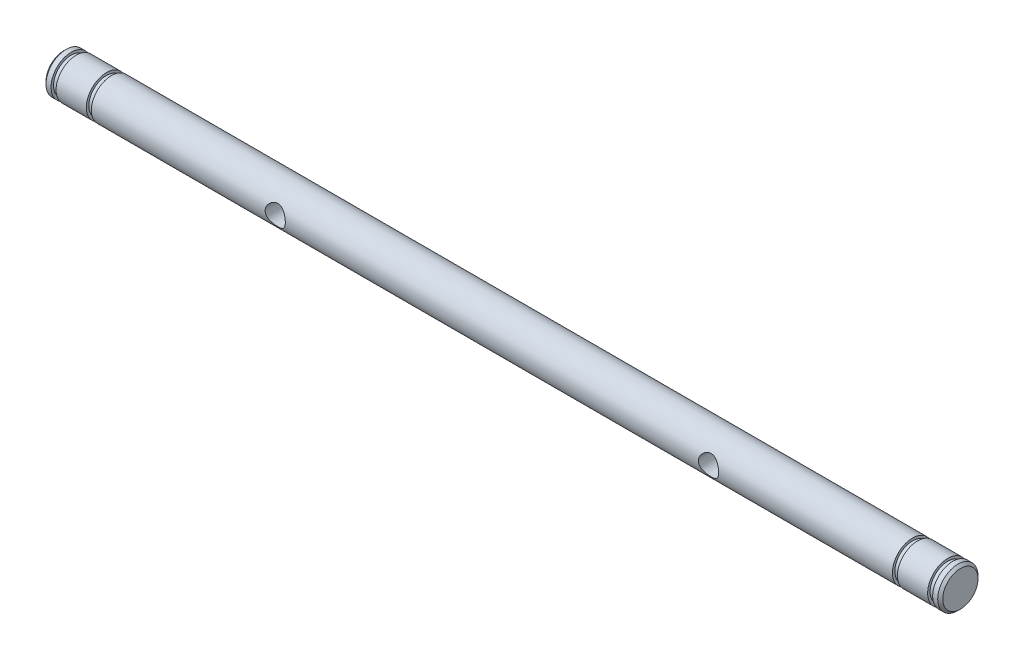
ISO-10303-21;
HEADER;
FILE_DESCRIPTION(('STEP AP214'),'2;1');
FILE_NAME('part.step','',(''),(''),'','','');
FILE_SCHEMA(('AUTOMOTIVE_DESIGN { 1 0 10303 214 1 1 1 1 }'));
ENDSEC;
DATA;
#1=APPLICATION_CONTEXT('core data for automotive mechanical design processes');
#2=APPLICATION_PROTOCOL_DEFINITION('international standard','automotive_design',2000,#1);
#3=PRODUCT_CONTEXT('',#1,'mechanical');
#4=PRODUCT('Part','Part','',(#3));
#5=PRODUCT_RELATED_PRODUCT_CATEGORY('part','',(#4));
#6=PRODUCT_DEFINITION_FORMATION('','',#4);
#7=PRODUCT_DEFINITION_CONTEXT('part definition',#1,'design');
#8=PRODUCT_DEFINITION('design','',#6,#7);
#9=PRODUCT_DEFINITION_SHAPE('','',#8);
#10=(LENGTH_UNIT() NAMED_UNIT(*) SI_UNIT(.MILLI.,.METRE.));
#11=(NAMED_UNIT(*) PLANE_ANGLE_UNIT() SI_UNIT($,.RADIAN.));
#12=(NAMED_UNIT(*) SI_UNIT($,.STERADIAN.) SOLID_ANGLE_UNIT());
#13=UNCERTAINTY_MEASURE_WITH_UNIT(LENGTH_MEASURE(1.E-05),#10,'distance_accuracy_value','');
#14=(GEOMETRIC_REPRESENTATION_CONTEXT(3) GLOBAL_UNCERTAINTY_ASSIGNED_CONTEXT((#13)) GLOBAL_UNIT_ASSIGNED_CONTEXT((#10,
#11,#12)) REPRESENTATION_CONTEXT('',''));
#15=CARTESIAN_POINT('',(0.,0.,0.));
#16=DIRECTION('',(0.,0.,1.));
#17=DIRECTION('',(1.,0.,0.));
#18=AXIS2_PLACEMENT_3D('',#15,#16,#17);
#19=CARTESIAN_POINT('',(79.5,3.5,0.));
#20=DIRECTION('',(-1.,0.,0.));
#21=DIRECTION('',(0.,0.,1.));
#22=AXIS2_PLACEMENT_3D('',#19,#20,#21);
#23=PLANE('',#22);
#24=CARTESIAN_POINT('',(79.5,0.,0.));
#25=DIRECTION('',(-1.,0.,0.));
#26=DIRECTION('',(0.,0.,1.));
#27=AXIS2_PLACEMENT_3D('',#24,#25,#26);
#28=CIRCLE('',#27,4.);
#29=CARTESIAN_POINT('',(79.5,0.,4.));
#30=VERTEX_POINT('',#29);
#31=EDGE_CURVE('E100',#30,#30,#28,.T.);
#32=ORIENTED_EDGE('',*,*,#31,.F.);
#33=EDGE_LOOP('',(#32));
#34=FACE_BOUND('',#33,.T.);
#35=CARTESIAN_POINT('',(79.5,0.,0.));
#36=DIRECTION('',(-1.,0.,0.));
#37=DIRECTION('',(0.,0.,1.));
#38=AXIS2_PLACEMENT_3D('',#35,#36,#37);
#39=CIRCLE('',#38,3.5);
#40=CARTESIAN_POINT('',(79.5,0.,3.5));
#41=VERTEX_POINT('',#40);
#42=EDGE_CURVE('E145',#41,#41,#39,.T.);
#43=ORIENTED_EDGE('',*,*,#42,.T.);
#44=EDGE_LOOP('',(#43));
#45=FACE_BOUND('',#44,.T.);
#46=ADVANCED_FACE('F44',(#34,#45),#23,.F.);
#47=CARTESIAN_POINT('',(25.5103340616513,0.,0.));
#48=DIRECTION('',(-1.,0.,0.));
#49=DIRECTION('',(0.,0.,1.));
#50=AXIS2_PLACEMENT_3D('',#47,#48,#49);
#51=CYLINDRICAL_SURFACE('',#50,3.99999999999999);
#52=CARTESIAN_POINT('',(-41.,0.,3.99999999999999));
#53=CARTESIAN_POINT('',(-41.0000066046344,-0.105143925902467,3.99999426810081));
#54=CARTESIAN_POINT('',(-41.0083401462421,-0.210413199395126,3.99580982039512));
#55=CARTESIAN_POINT('',(-41.0413057606831,-0.417840470537793,3.97948312074313));
#56=CARTESIAN_POINT('',(-41.0659687859956,-0.519992173427259,3.96732575657838));
#57=CARTESIAN_POINT('',(-41.1303876172333,-0.717867089760898,3.9363255880675));
#58=CARTESIAN_POINT('',(-41.1700847684959,-0.813613605878294,3.91750878355074));
#59=CARTESIAN_POINT('',(-41.26314124273,-0.9969452336132,3.87491553031522));
#60=CARTESIAN_POINT('',(-41.3164994884977,-1.08453098798012,3.85113947267049));
#61=CARTESIAN_POINT('',(-41.4390344989706,-1.25501563552382,3.79912516516123));
#62=CARTESIAN_POINT('',(-41.5089729584793,-1.33731042224422,3.77070398255073));
#63=CARTESIAN_POINT('',(-41.6610429584941,-1.48955888973396,3.71319940493485));
#64=CARTESIAN_POINT('',(-41.7431837035449,-1.55950316621354,3.68411552418068));
#65=CARTESIAN_POINT('',(-41.9249666990468,-1.69050400090056,3.62597902394694));
#66=CARTESIAN_POINT('',(-42.0254721966918,-1.75045067110328,3.59710373940263));
#67=CARTESIAN_POINT('',(-42.2367346719724,-1.85233645378139,3.5457195754464));
#68=CARTESIAN_POINT('',(-42.3474842574455,-1.89428842993267,3.52320615213978));
#69=CARTESIAN_POINT('',(-42.5693302108438,-1.95626488437718,3.48915734075616));
#70=CARTESIAN_POINT('',(-42.6800089041348,-1.97745171416089,3.47704543167426));
#71=CARTESIAN_POINT('',(-42.9039576755589,-2.00085398661769,3.46363779897054));
#72=CARTESIAN_POINT('',(-43.0172250817423,-2.00308817674615,3.46233138686575));
#73=CARTESIAN_POINT('',(-43.2285720486307,-1.98937457434459,3.47021860514496));
#74=CARTESIAN_POINT('',(-43.3268480624461,-1.97556911907365,3.47817527324026));
#75=CARTESIAN_POINT('',(-43.5194438187461,-1.93387969811387,3.50152457467699));
#76=CARTESIAN_POINT('',(-43.6137622906106,-1.90599124779531,3.51691957663551));
#77=CARTESIAN_POINT('',(-43.7984582651313,-1.83641956077201,3.55374952825481));
#78=CARTESIAN_POINT('',(-43.8886927975716,-1.79443013423199,3.57531681327996));
#79=CARTESIAN_POINT('',(-44.06126858518,-1.69808337533601,3.62206808562806));
#80=CARTESIAN_POINT('',(-44.1436062712002,-1.64372048762494,3.6472536956038));
#81=CARTESIAN_POINT('',(-44.3090425054865,-1.51613210982558,3.7022631580657));
#82=CARTESIAN_POINT('',(-44.3909137471523,-1.44138891673857,3.73227020473491));
#83=CARTESIAN_POINT('',(-44.5414708371818,-1.27911115748275,3.79095246600813));
#84=CARTESIAN_POINT('',(-44.6101503840678,-1.19157051314857,3.81962703917601));
#85=CARTESIAN_POINT('',(-44.7353713220594,-1.0010330116637,3.87403974565927));
#86=CARTESIAN_POINT('',(-44.7912009448915,-0.897507183198822,3.89957968324013));
#87=CARTESIAN_POINT('',(-44.884194058086,-0.680932430977599,3.94315762242484));
#88=CARTESIAN_POINT('',(-44.9213723700303,-0.567891152530558,3.96120157887105));
#89=CARTESIAN_POINT('',(-44.9729508074333,-0.345532983321411,3.9864866748287));
#90=CARTESIAN_POINT('',(-44.9889824714936,-0.236683061096659,3.99449876602619));
#91=CARTESIAN_POINT('',(-45.002929462269,-0.0175591998987092,4.00146026918206));
#92=CARTESIAN_POINT('',(-45.0008533712789,0.0927140397398121,4.00041397442636));
#93=CARTESIAN_POINT('',(-44.9795866231625,0.302465943971969,3.98982384506869));
#94=CARTESIAN_POINT('',(-44.96173493454,0.402118816099855,3.98094491376336));
#95=CARTESIAN_POINT('',(-44.9115238562098,0.596813784603877,3.9564434262968));
#96=CARTESIAN_POINT('',(-44.879162867093,0.69185537138217,3.94082012668823));
#97=CARTESIAN_POINT('',(-44.8000030671339,0.877777216899141,3.90368502827175));
#98=CARTESIAN_POINT('',(-44.7528178997674,0.968460794011601,3.88201763539261));
#99=CARTESIAN_POINT('',(-44.6457849287069,1.14092272339854,3.83487948634834));
#100=CARTESIAN_POINT('',(-44.5859317308092,1.22269725955318,3.80940711133876));
#101=CARTESIAN_POINT('',(-44.4484791493386,1.38353537857843,3.75416442672395));
#102=CARTESIAN_POINT('',(-44.3697142631097,1.46154415563805,3.72421769686997));
#103=CARTESIAN_POINT('',(-44.2001496974445,1.60371264223771,3.66524783217639));
#104=CARTESIAN_POINT('',(-44.1093417623042,1.66786277142375,3.63622534800093));
#105=CARTESIAN_POINT('',(-43.9127126916541,1.78341582895804,3.58102384412978));
#106=CARTESIAN_POINT('',(-43.806377467811,1.8340509916005,3.5550505917812));
#107=CARTESIAN_POINT('',(-43.5849798648501,1.91616565186941,3.51148144588268));
#108=CARTESIAN_POINT('',(-43.4699289470662,1.94766983173403,3.49387476443499));
#109=CARTESIAN_POINT('',(-43.2461795542306,1.98772337493375,3.47123002051603));
#110=CARTESIAN_POINT('',(-43.1379314931295,1.99818599281091,3.46514766930129));
#111=CARTESIAN_POINT('',(-42.9211058656709,2.00137830875241,3.46330709283205));
#112=CARTESIAN_POINT('',(-42.8125284625243,1.99411569324649,3.46754439252779));
#113=CARTESIAN_POINT('',(-42.6090329969331,1.96385225118662,3.48475724102152));
#114=CARTESIAN_POINT('',(-42.5137990597105,1.94241662868607,3.49686188965315));
#115=CARTESIAN_POINT('',(-42.3283837611513,1.88635071644883,3.52742032375304));
#116=CARTESIAN_POINT('',(-42.2382040358159,1.85171618231985,3.54587615139335));
#117=CARTESIAN_POINT('',(-42.0587502980269,1.76763149060114,3.5885706072907));
#118=CARTESIAN_POINT('',(-41.9699441963419,1.71734227563141,3.6131144479184));
#119=CARTESIAN_POINT('',(-41.8014509276375,1.60430194327479,3.66470663269719));
#120=CARTESIAN_POINT('',(-41.7217685389578,1.54154434248313,3.6917562759122));
#121=CARTESIAN_POINT('',(-41.5637160352907,1.39640665332276,3.74924646316183));
#122=CARTESIAN_POINT('',(-41.4866817952994,1.31256884599453,3.77969966613255));
#123=CARTESIAN_POINT('',(-41.3474740331295,1.1323096124664,3.8375550451986));
#124=CARTESIAN_POINT('',(-41.2853085210602,1.0358814466104,3.86495557252389));
#125=CARTESIAN_POINT('',(-41.1775272745759,0.831863193565902,3.91396019133073));
#126=CARTESIAN_POINT('',(-41.1320316615271,0.724199007553472,3.93552192987865));
#127=CARTESIAN_POINT('',(-41.0603836644852,0.501484202276184,3.97002682597973));
#128=CARTESIAN_POINT('',(-41.0341763063886,0.386455599178209,3.98299446726135));
#129=CARTESIAN_POINT('',(-41.0122051778285,0.225203892981798,3.99390923826955));
#130=CARTESIAN_POINT('',(-41.0076347182673,0.180323758883137,3.99618730680501));
#131=CARTESIAN_POINT('',(-41.0015306689718,0.0903034636101871,3.9992339395363));
#132=CARTESIAN_POINT('',(-40.9999971630596,0.0451632952932588,4.00000246206761));
#133=CARTESIAN_POINT('',(-41.,0.,3.99999999999999));
#134=B_SPLINE_CURVE_WITH_KNOTS('',3,(#52,#53,#54,#55,#56,#57,#58,#59,#60,#61,#62,#63,#64,#65,
#66,#67,#68,#69,#70,#71,#72,#73,#74,#75,#76,#77,#78,#79,#80,#81,#82,#83,#84,#85,#86,#87,#88,#89,
#90,#91,#92,#93,#94,#95,#96,#97,#98,#99,#100,#101,#102,#103,#104,#105,#106,#107,#108,#109,#110,
#111,#112,#113,#114,#115,#116,#117,#118,#119,#120,#121,#122,#123,#124,#125,#126,#127,#128,#129,
#130,#131,#132,#133),.UNSPECIFIED.,.T.,.F.,(4,2,2,2,2,2,2,2,2,2,2,2,2,2,2,2,2,2,2,2,2,2,2,2,2,2,
2,2,2,2,2,2,2,2,2,2,2,2,2,2,4),(0.,0.315248514840586,0.631096299418396,0.945724310984597,
1.26032752116314,1.59396351743618,1.92785247530807,2.28763452861506,2.64715895796562,
2.9851602428046,3.32282714658041,3.6201142481864,3.91749607851357,4.22180480336975,
4.52625042520444,4.86929882667757,5.21251069197373,5.57166044428882,5.93052433824559,
6.25966580942691,6.58865129022952,6.89213813012244,7.19565843261863,7.50785712055797,
7.82018901496679,8.16319221288838,8.50643177230864,8.86629364323452,9.22569023890902,
9.55058615006094,9.87534119729357,10.1691586049771,10.463070575767,10.7767291356058,
11.0905512228726,11.4425048551434,11.7946476676249,12.1492802732705,12.502898172423,
12.6383056026783,12.7737167702213),.UNSPECIFIED.);
#135=CARTESIAN_POINT('',(-41.,0.,3.99999999999999));
#136=VERTEX_POINT('',#135);
#137=EDGE_CURVE('E48',#136,#136,#134,.T.);
#138=ORIENTED_EDGE('',*,*,#137,.T.);
#139=EDGE_LOOP('',(#138));
#140=FACE_BOUND('',#139,.T.);
#141=CARTESIAN_POINT('',(-41.,0.,-3.99999999999999));
#142=CARTESIAN_POINT('',(-41.0000066046344,0.105143925902467,-3.99999426810081));
#143=CARTESIAN_POINT('',(-41.0083401462421,0.210413199395126,-3.99580982039512));
#144=CARTESIAN_POINT('',(-41.0413057606831,0.417840470537793,-3.97948312074313));
#145=CARTESIAN_POINT('',(-41.0659687859956,0.519992173427259,-3.96732575657838));
#146=CARTESIAN_POINT('',(-41.1303876172333,0.717867089760898,-3.9363255880675));
#147=CARTESIAN_POINT('',(-41.1700847684959,0.813613605878294,-3.91750878355074));
#148=CARTESIAN_POINT('',(-41.26314124273,0.9969452336132,-3.87491553031522));
#149=CARTESIAN_POINT('',(-41.3164994884977,1.08453098798012,-3.85113947267049));
#150=CARTESIAN_POINT('',(-41.4390344989706,1.25501563552382,-3.79912516516123));
#151=CARTESIAN_POINT('',(-41.5089729584793,1.33731042224422,-3.77070398255073));
#152=CARTESIAN_POINT('',(-41.6610429584941,1.48955888973396,-3.71319940493485));
#153=CARTESIAN_POINT('',(-41.7431837035449,1.55950316621354,-3.68411552418068));
#154=CARTESIAN_POINT('',(-41.9249666990468,1.69050400090056,-3.62597902394694));
#155=CARTESIAN_POINT('',(-42.0254721966918,1.75045067110328,-3.59710373940263));
#156=CARTESIAN_POINT('',(-42.2367346719724,1.85233645378139,-3.5457195754464));
#157=CARTESIAN_POINT('',(-42.3474842574455,1.89428842993267,-3.52320615213978));
#158=CARTESIAN_POINT('',(-42.5693302108438,1.95626488437718,-3.48915734075616));
#159=CARTESIAN_POINT('',(-42.6800089041348,1.97745171416089,-3.47704543167426));
#160=CARTESIAN_POINT('',(-42.9039576755589,2.00085398661769,-3.46363779897054));
#161=CARTESIAN_POINT('',(-43.0172250817423,2.00308817674615,-3.46233138686575));
#162=CARTESIAN_POINT('',(-43.2285720486307,1.98937457434459,-3.47021860514496));
#163=CARTESIAN_POINT('',(-43.3268480624461,1.97556911907365,-3.47817527324026));
#164=CARTESIAN_POINT('',(-43.5194438187461,1.93387969811387,-3.50152457467699));
#165=CARTESIAN_POINT('',(-43.6137622906106,1.90599124779531,-3.51691957663551));
#166=CARTESIAN_POINT('',(-43.7984582651313,1.83641956077201,-3.55374952825481));
#167=CARTESIAN_POINT('',(-43.8886927975716,1.79443013423199,-3.57531681327996));
#168=CARTESIAN_POINT('',(-44.06126858518,1.69808337533601,-3.62206808562806));
#169=CARTESIAN_POINT('',(-44.1436062712002,1.64372048762494,-3.6472536956038));
#170=CARTESIAN_POINT('',(-44.3090425054865,1.51613210982558,-3.7022631580657));
#171=CARTESIAN_POINT('',(-44.3909137471523,1.44138891673857,-3.73227020473491));
#172=CARTESIAN_POINT('',(-44.5414708371818,1.27911115748275,-3.79095246600813));
#173=CARTESIAN_POINT('',(-44.6101503840678,1.19157051314857,-3.81962703917601));
#174=CARTESIAN_POINT('',(-44.7353713220594,1.0010330116637,-3.87403974565927));
#175=CARTESIAN_POINT('',(-44.7912009448915,0.897507183198822,-3.89957968324013));
#176=CARTESIAN_POINT('',(-44.884194058086,0.680932430977599,-3.94315762242484));
#177=CARTESIAN_POINT('',(-44.9213723700303,0.567891152530558,-3.96120157887105));
#178=CARTESIAN_POINT('',(-44.9729508074333,0.345532983321411,-3.9864866748287));
#179=CARTESIAN_POINT('',(-44.9889824714936,0.236683061096659,-3.99449876602619));
#180=CARTESIAN_POINT('',(-45.002929462269,0.0175591998987092,-4.00146026918206));
#181=CARTESIAN_POINT('',(-45.0008533712789,-0.0927140397398121,-4.00041397442636));
#182=CARTESIAN_POINT('',(-44.9795866231625,-0.302465943971969,-3.98982384506869));
#183=CARTESIAN_POINT('',(-44.96173493454,-0.402118816099855,-3.98094491376336));
#184=CARTESIAN_POINT('',(-44.9115238562098,-0.596813784603877,-3.9564434262968));
#185=CARTESIAN_POINT('',(-44.879162867093,-0.69185537138217,-3.94082012668823));
#186=CARTESIAN_POINT('',(-44.8000030671339,-0.877777216899141,-3.90368502827175));
#187=CARTESIAN_POINT('',(-44.7528178997674,-0.968460794011601,-3.88201763539261));
#188=CARTESIAN_POINT('',(-44.6457849287069,-1.14092272339854,-3.83487948634834));
#189=CARTESIAN_POINT('',(-44.5859317308092,-1.22269725955318,-3.80940711133876));
#190=CARTESIAN_POINT('',(-44.4484791493386,-1.38353537857843,-3.75416442672395));
#191=CARTESIAN_POINT('',(-44.3697142631097,-1.46154415563805,-3.72421769686997));
#192=CARTESIAN_POINT('',(-44.2001496974445,-1.60371264223771,-3.66524783217639));
#193=CARTESIAN_POINT('',(-44.1093417623042,-1.66786277142375,-3.63622534800093));
#194=CARTESIAN_POINT('',(-43.9127126916541,-1.78341582895804,-3.58102384412978));
#195=CARTESIAN_POINT('',(-43.806377467811,-1.8340509916005,-3.5550505917812));
#196=CARTESIAN_POINT('',(-43.5849798648501,-1.91616565186941,-3.51148144588268));
#197=CARTESIAN_POINT('',(-43.4699289470662,-1.94766983173403,-3.49387476443499));
#198=CARTESIAN_POINT('',(-43.2461795542306,-1.98772337493375,-3.47123002051603));
#199=CARTESIAN_POINT('',(-43.1379314931295,-1.99818599281091,-3.46514766930129));
#200=CARTESIAN_POINT('',(-42.9211058656709,-2.00137830875241,-3.46330709283205));
#201=CARTESIAN_POINT('',(-42.8125284625243,-1.99411569324649,-3.46754439252779));
#202=CARTESIAN_POINT('',(-42.6090329969331,-1.96385225118662,-3.48475724102152));
#203=CARTESIAN_POINT('',(-42.5137990597105,-1.94241662868607,-3.49686188965315));
#204=CARTESIAN_POINT('',(-42.3283837611513,-1.88635071644883,-3.52742032375304));
#205=CARTESIAN_POINT('',(-42.2382040358159,-1.85171618231985,-3.54587615139335));
#206=CARTESIAN_POINT('',(-42.0587502980269,-1.76763149060114,-3.5885706072907));
#207=CARTESIAN_POINT('',(-41.9699441963419,-1.71734227563141,-3.6131144479184));
#208=CARTESIAN_POINT('',(-41.8014509276375,-1.60430194327479,-3.66470663269719));
#209=CARTESIAN_POINT('',(-41.7217685389578,-1.54154434248313,-3.6917562759122));
#210=CARTESIAN_POINT('',(-41.5637160352907,-1.39640665332276,-3.74924646316183));
#211=CARTESIAN_POINT('',(-41.4866817952994,-1.31256884599453,-3.77969966613255));
#212=CARTESIAN_POINT('',(-41.3474740331295,-1.1323096124664,-3.8375550451986));
#213=CARTESIAN_POINT('',(-41.2853085210602,-1.0358814466104,-3.86495557252389));
#214=CARTESIAN_POINT('',(-41.1775272745759,-0.831863193565902,-3.91396019133073));
#215=CARTESIAN_POINT('',(-41.1320316615271,-0.724199007553472,-3.93552192987865));
#216=CARTESIAN_POINT('',(-41.0603836644852,-0.501484202276184,-3.97002682597973));
#217=CARTESIAN_POINT('',(-41.0341763063886,-0.386455599178209,-3.98299446726135));
#218=CARTESIAN_POINT('',(-41.0122051778285,-0.225203892981798,-3.99390923826955));
#219=CARTESIAN_POINT('',(-41.0076347182673,-0.180323758883137,-3.99618730680501));
#220=CARTESIAN_POINT('',(-41.0015306689718,-0.0903034636101871,-3.9992339395363));
#221=CARTESIAN_POINT('',(-40.9999971630596,-0.0451632952932588,-4.00000246206761));
#222=CARTESIAN_POINT('',(-41.,0.,-3.99999999999999));
#223=B_SPLINE_CURVE_WITH_KNOTS('',3,(#141,#142,#143,#144,#145,#146,#147,#148,#149,#150,#151,
#152,#153,#154,#155,#156,#157,#158,#159,#160,#161,#162,#163,#164,#165,#166,#167,#168,#169,#170,
#171,#172,#173,#174,#175,#176,#177,#178,#179,#180,#181,#182,#183,#184,#185,#186,#187,#188,#189,
#190,#191,#192,#193,#194,#195,#196,#197,#198,#199,#200,#201,#202,#203,#204,#205,#206,#207,#208,
#209,#210,#211,#212,#213,#214,#215,#216,#217,#218,#219,#220,#221,#222),.UNSPECIFIED.,.T.,.F.,(4,
2,2,2,2,2,2,2,2,2,2,2,2,2,2,2,2,2,2,2,2,2,2,2,2,2,2,2,2,2,2,2,2,2,2,2,2,2,2,2,4),(0.,
0.315248514840586,0.631096299418396,0.945724310984597,1.26032752116314,1.59396351743618,
1.92785247530807,2.28763452861506,2.64715895796562,2.9851602428046,3.32282714658041,
3.6201142481864,3.91749607851357,4.22180480336975,4.52625042520444,4.86929882667757,
5.21251069197373,5.57166044428882,5.93052433824559,6.25966580942691,6.58865129022952,
6.89213813012244,7.19565843261863,7.50785712055797,7.82018901496679,8.16319221288838,
8.50643177230864,8.86629364323452,9.22569023890902,9.55058615006094,9.87534119729357,
10.1691586049771,10.463070575767,10.7767291356058,11.0905512228726,11.4425048551434,
11.7946476676249,12.1492802732705,12.502898172423,12.6383056026783,12.7737167702213),.UNSPECIFIED.);
#224=CARTESIAN_POINT('',(-41.,0.,-3.99999999999999));
#225=VERTEX_POINT('',#224);
#226=EDGE_CURVE('E12',#225,#225,#223,.T.);
#227=ORIENTED_EDGE('',*,*,#226,.T.);
#228=EDGE_LOOP('',(#227));
#229=FACE_BOUND('',#228,.T.);
#230=CARTESIAN_POINT('',(45.,0.,3.99999999999999));
#231=CARTESIAN_POINT('',(44.9999933953656,-0.105143925902467,3.99999426810081));
#232=CARTESIAN_POINT('',(44.9916598537579,-0.210413199395126,3.99580982039512));
#233=CARTESIAN_POINT('',(44.9586942393169,-0.417840470537793,3.97948312074313));
#234=CARTESIAN_POINT('',(44.9340312140044,-0.519992173427259,3.96732575657838));
#235=CARTESIAN_POINT('',(44.8696123827667,-0.717867089760898,3.9363255880675));
#236=CARTESIAN_POINT('',(44.8299152315041,-0.813613605878295,3.91750878355074));
#237=CARTESIAN_POINT('',(44.73685875727,-0.9969452336132,3.87491553031522));
#238=CARTESIAN_POINT('',(44.6835005115023,-1.08453098798012,3.85113947267049));
#239=CARTESIAN_POINT('',(44.5609655010294,-1.25501563552382,3.79912516516123));
#240=CARTESIAN_POINT('',(44.4910270415207,-1.33731042224422,3.77070398255073));
#241=CARTESIAN_POINT('',(44.3389570415059,-1.48955888973396,3.71319940493485));
#242=CARTESIAN_POINT('',(44.2568162964551,-1.55950316621354,3.68411552418068));
#243=CARTESIAN_POINT('',(44.0750333009532,-1.69050400090056,3.62597902394694));
#244=CARTESIAN_POINT('',(43.9745278033082,-1.75045067110328,3.59710373940262));
#245=CARTESIAN_POINT('',(43.7632653280276,-1.8523364537814,3.5457195754464));
#246=CARTESIAN_POINT('',(43.6525157425545,-1.89428842993267,3.52320615213978));
#247=CARTESIAN_POINT('',(43.4306697891561,-1.95626488437718,3.48915734075616));
#248=CARTESIAN_POINT('',(43.3199910958652,-1.97745171416089,3.47704543167426));
#249=CARTESIAN_POINT('',(43.096042324441,-2.00085398661769,3.46363779897054));
#250=CARTESIAN_POINT('',(42.9827749182577,-2.00308817674615,3.46233138686575));
#251=CARTESIAN_POINT('',(42.7714279513693,-1.98937457434459,3.47021860514496));
#252=CARTESIAN_POINT('',(42.6731519375539,-1.97556911907365,3.47817527324026));
#253=CARTESIAN_POINT('',(42.4805561812539,-1.93387969811387,3.50152457467699));
#254=CARTESIAN_POINT('',(42.3862377093894,-1.90599124779531,3.51691957663551));
#255=CARTESIAN_POINT('',(42.2015417348687,-1.83641956077201,3.55374952825481));
#256=CARTESIAN_POINT('',(42.1113072024284,-1.79443013423199,3.57531681327996));
#257=CARTESIAN_POINT('',(41.93873141482,-1.69808337533601,3.62206808562806));
#258=CARTESIAN_POINT('',(41.8563937287998,-1.64372048762494,3.6472536956038));
#259=CARTESIAN_POINT('',(41.6909574945135,-1.51613210982558,3.7022631580657));
#260=CARTESIAN_POINT('',(41.6090862528477,-1.44138891673856,3.73227020473491));
#261=CARTESIAN_POINT('',(41.4585291628182,-1.27911115748275,3.79095246600813));
#262=CARTESIAN_POINT('',(41.3898496159322,-1.19157051314857,3.81962703917601));
#263=CARTESIAN_POINT('',(41.2646286779405,-1.0010330116637,3.87403974565927));
#264=CARTESIAN_POINT('',(41.2087990551085,-0.897507183198822,3.89957968324013));
#265=CARTESIAN_POINT('',(41.115805941914,-0.680932430977599,3.94315762242484));
#266=CARTESIAN_POINT('',(41.0786276299697,-0.567891152530558,3.96120157887105));
#267=CARTESIAN_POINT('',(41.0270491925666,-0.345532983321411,3.9864866748287));
#268=CARTESIAN_POINT('',(41.0110175285064,-0.236683061096659,3.99449876602619));
#269=CARTESIAN_POINT('',(40.997070537731,-0.0175591998987095,4.00146026918206));
#270=CARTESIAN_POINT('',(40.9991466287211,0.0927140397398119,4.00041397442636));
#271=CARTESIAN_POINT('',(41.0204133768375,0.302465943971969,3.98982384506869));
#272=CARTESIAN_POINT('',(41.03826506546,0.402118816099855,3.98094491376336));
#273=CARTESIAN_POINT('',(41.0884761437902,0.596813784603877,3.9564434262968));
#274=CARTESIAN_POINT('',(41.120837132907,0.69185537138217,3.94082012668823));
#275=CARTESIAN_POINT('',(41.199996932866,0.877777216899141,3.90368502827175));
#276=CARTESIAN_POINT('',(41.2471821002326,0.968460794011601,3.88201763539261));
#277=CARTESIAN_POINT('',(41.3542150712931,1.14092272339854,3.83487948634834));
#278=CARTESIAN_POINT('',(41.4140682691908,1.22269725955318,3.80940711133876));
#279=CARTESIAN_POINT('',(41.5515208506614,1.38353537857843,3.75416442672395));
#280=CARTESIAN_POINT('',(41.6302857368903,1.46154415563805,3.72421769686997));
#281=CARTESIAN_POINT('',(41.7998503025554,1.60371264223771,3.66524783217639));
#282=CARTESIAN_POINT('',(41.8906582376958,1.66786277142375,3.63622534800093));
#283=CARTESIAN_POINT('',(42.0872873083459,1.78341582895804,3.58102384412978));
#284=CARTESIAN_POINT('',(42.193622532189,1.8340509916005,3.5550505917812));
#285=CARTESIAN_POINT('',(42.4150201351499,1.91616565186941,3.51148144588268));
#286=CARTESIAN_POINT('',(42.5300710529338,1.94766983173403,3.49387476443499));
#287=CARTESIAN_POINT('',(42.7538204457694,1.98772337493375,3.47123002051603));
#288=CARTESIAN_POINT('',(42.8620685068705,1.99818599281091,3.46514766930129));
#289=CARTESIAN_POINT('',(43.078894134329,2.00137830875241,3.46330709283205));
#290=CARTESIAN_POINT('',(43.1874715374757,1.99411569324649,3.46754439252779));
#291=CARTESIAN_POINT('',(43.3909670030669,1.96385225118662,3.48475724102152));
#292=CARTESIAN_POINT('',(43.4862009402895,1.94241662868607,3.49686188965315));
#293=CARTESIAN_POINT('',(43.6716162388487,1.88635071644883,3.52742032375304));
#294=CARTESIAN_POINT('',(43.7617959641841,1.85171618231985,3.54587615139335));
#295=CARTESIAN_POINT('',(43.9412497019731,1.76763149060113,3.5885706072907));
#296=CARTESIAN_POINT('',(44.0300558036581,1.71734227563141,3.6131144479184));
#297=CARTESIAN_POINT('',(44.1985490723625,1.60430194327479,3.66470663269719));
#298=CARTESIAN_POINT('',(44.2782314610422,1.54154434248313,3.6917562759122));
#299=CARTESIAN_POINT('',(44.4362839647093,1.39640665332276,3.74924646316183));
#300=CARTESIAN_POINT('',(44.5133182047006,1.31256884599453,3.77969966613255));
#301=CARTESIAN_POINT('',(44.6525259668705,1.1323096124664,3.8375550451986));
#302=CARTESIAN_POINT('',(44.7146914789398,1.0358814466104,3.86495557252389));
#303=CARTESIAN_POINT('',(44.8224727254241,0.831863193565902,3.91396019133073));
#304=CARTESIAN_POINT('',(44.8679683384729,0.724199007553472,3.93552192987865));
#305=CARTESIAN_POINT('',(44.9396163355148,0.501484202276184,3.97002682597973));
#306=CARTESIAN_POINT('',(44.9658236936114,0.386455599178209,3.98299446726135));
#307=CARTESIAN_POINT('',(44.9877948221715,0.225203892981798,3.99390923826955));
#308=CARTESIAN_POINT('',(44.9923652817327,0.180323758883137,3.99618730680501));
#309=CARTESIAN_POINT('',(44.9984693310282,0.0903034636101871,3.9992339395363));
#310=CARTESIAN_POINT('',(45.0000028369404,0.0451632952932588,4.00000246206761));
#311=CARTESIAN_POINT('',(45.,0.,3.99999999999999));
#312=B_SPLINE_CURVE_WITH_KNOTS('',3,(#230,#231,#232,#233,#234,#235,#236,#237,#238,#239,#240,
#241,#242,#243,#244,#245,#246,#247,#248,#249,#250,#251,#252,#253,#254,#255,#256,#257,#258,#259,
#260,#261,#262,#263,#264,#265,#266,#267,#268,#269,#270,#271,#272,#273,#274,#275,#276,#277,#278,
#279,#280,#281,#282,#283,#284,#285,#286,#287,#288,#289,#290,#291,#292,#293,#294,#295,#296,#297,
#298,#299,#300,#301,#302,#303,#304,#305,#306,#307,#308,#309,#310,#311),.UNSPECIFIED.,.T.,.F.,(4,
2,2,2,2,2,2,2,2,2,2,2,2,2,2,2,2,2,2,2,2,2,2,2,2,2,2,2,2,2,2,2,2,2,2,2,2,2,2,2,4),(0.,
0.315248514840586,0.631096299418396,0.945724310984597,1.26032752116314,1.59396351743618,
1.92785247530807,2.28763452861507,2.64715895796563,2.9851602428046,3.32282714658041,
3.62011424818641,3.91749607851357,4.22180480336975,4.52625042520444,4.86929882667758,
5.21251069197373,5.57166044428882,5.93052433824559,6.25966580942691,6.58865129022952,
6.89213813012244,7.19565843261863,7.50785712055797,7.82018901496679,8.16319221288838,
8.50643177230864,8.86629364323453,9.22569023890902,9.55058615006094,9.87534119729358,
10.1691586049771,10.463070575767,10.7767291356058,11.0905512228726,11.4425048551434,
11.7946476676249,12.1492802732705,12.502898172423,12.6383056026783,12.7737167702213),.UNSPECIFIED.);
#313=CARTESIAN_POINT('',(45.,0.,3.99999999999999));
#314=VERTEX_POINT('',#313);
#315=EDGE_CURVE('E65',#314,#314,#312,.T.);
#316=ORIENTED_EDGE('',*,*,#315,.T.);
#317=EDGE_LOOP('',(#316));
#318=FACE_BOUND('',#317,.T.);
#319=CARTESIAN_POINT('',(45.,0.,-3.99999999999999));
#320=CARTESIAN_POINT('',(44.9999933953656,0.105143925902467,-3.99999426810081));
#321=CARTESIAN_POINT('',(44.9916598537579,0.210413199395126,-3.99580982039512));
#322=CARTESIAN_POINT('',(44.9586942393169,0.417840470537793,-3.97948312074313));
#323=CARTESIAN_POINT('',(44.9340312140044,0.519992173427259,-3.96732575657838));
#324=CARTESIAN_POINT('',(44.8696123827667,0.717867089760898,-3.9363255880675));
#325=CARTESIAN_POINT('',(44.8299152315041,0.813613605878295,-3.91750878355074));
#326=CARTESIAN_POINT('',(44.73685875727,0.9969452336132,-3.87491553031522));
#327=CARTESIAN_POINT('',(44.6835005115023,1.08453098798012,-3.85113947267049));
#328=CARTESIAN_POINT('',(44.5609655010294,1.25501563552382,-3.79912516516123));
#329=CARTESIAN_POINT('',(44.4910270415207,1.33731042224422,-3.77070398255073));
#330=CARTESIAN_POINT('',(44.3389570415059,1.48955888973396,-3.71319940493485));
#331=CARTESIAN_POINT('',(44.2568162964551,1.55950316621354,-3.68411552418068));
#332=CARTESIAN_POINT('',(44.0750333009532,1.69050400090056,-3.62597902394694));
#333=CARTESIAN_POINT('',(43.9745278033082,1.75045067110328,-3.59710373940262));
#334=CARTESIAN_POINT('',(43.7632653280276,1.8523364537814,-3.5457195754464));
#335=CARTESIAN_POINT('',(43.6525157425545,1.89428842993267,-3.52320615213978));
#336=CARTESIAN_POINT('',(43.4306697891561,1.95626488437718,-3.48915734075616));
#337=CARTESIAN_POINT('',(43.3199910958652,1.97745171416089,-3.47704543167426));
#338=CARTESIAN_POINT('',(43.096042324441,2.00085398661769,-3.46363779897054));
#339=CARTESIAN_POINT('',(42.9827749182577,2.00308817674615,-3.46233138686575));
#340=CARTESIAN_POINT('',(42.7714279513693,1.98937457434459,-3.47021860514496));
#341=CARTESIAN_POINT('',(42.6731519375539,1.97556911907365,-3.47817527324026));
#342=CARTESIAN_POINT('',(42.4805561812539,1.93387969811387,-3.50152457467699));
#343=CARTESIAN_POINT('',(42.3862377093894,1.90599124779531,-3.51691957663551));
#344=CARTESIAN_POINT('',(42.2015417348687,1.83641956077201,-3.55374952825481));
#345=CARTESIAN_POINT('',(42.1113072024284,1.79443013423199,-3.57531681327996));
#346=CARTESIAN_POINT('',(41.93873141482,1.69808337533601,-3.62206808562806));
#347=CARTESIAN_POINT('',(41.8563937287998,1.64372048762494,-3.6472536956038));
#348=CARTESIAN_POINT('',(41.6909574945135,1.51613210982558,-3.7022631580657));
#349=CARTESIAN_POINT('',(41.6090862528477,1.44138891673856,-3.73227020473491));
#350=CARTESIAN_POINT('',(41.4585291628182,1.27911115748275,-3.79095246600813));
#351=CARTESIAN_POINT('',(41.3898496159322,1.19157051314857,-3.81962703917601));
#352=CARTESIAN_POINT('',(41.2646286779405,1.0010330116637,-3.87403974565927));
#353=CARTESIAN_POINT('',(41.2087990551085,0.897507183198822,-3.89957968324013));
#354=CARTESIAN_POINT('',(41.115805941914,0.680932430977599,-3.94315762242484));
#355=CARTESIAN_POINT('',(41.0786276299697,0.567891152530558,-3.96120157887105));
#356=CARTESIAN_POINT('',(41.0270491925666,0.345532983321411,-3.9864866748287));
#357=CARTESIAN_POINT('',(41.0110175285064,0.236683061096659,-3.99449876602619));
#358=CARTESIAN_POINT('',(40.997070537731,0.0175591998987095,-4.00146026918206));
#359=CARTESIAN_POINT('',(40.9991466287211,-0.0927140397398119,-4.00041397442636));
#360=CARTESIAN_POINT('',(41.0204133768375,-0.302465943971969,-3.98982384506869));
#361=CARTESIAN_POINT('',(41.03826506546,-0.402118816099855,-3.98094491376336));
#362=CARTESIAN_POINT('',(41.0884761437902,-0.596813784603877,-3.9564434262968));
#363=CARTESIAN_POINT('',(41.120837132907,-0.69185537138217,-3.94082012668823));
#364=CARTESIAN_POINT('',(41.199996932866,-0.877777216899141,-3.90368502827175));
#365=CARTESIAN_POINT('',(41.2471821002326,-0.968460794011601,-3.88201763539261));
#366=CARTESIAN_POINT('',(41.3542150712931,-1.14092272339854,-3.83487948634834));
#367=CARTESIAN_POINT('',(41.4140682691908,-1.22269725955318,-3.80940711133876));
#368=CARTESIAN_POINT('',(41.5515208506614,-1.38353537857843,-3.75416442672395));
#369=CARTESIAN_POINT('',(41.6302857368903,-1.46154415563805,-3.72421769686997));
#370=CARTESIAN_POINT('',(41.7998503025554,-1.60371264223771,-3.66524783217639));
#371=CARTESIAN_POINT('',(41.8906582376958,-1.66786277142375,-3.63622534800093));
#372=CARTESIAN_POINT('',(42.0872873083459,-1.78341582895804,-3.58102384412978));
#373=CARTESIAN_POINT('',(42.193622532189,-1.8340509916005,-3.5550505917812));
#374=CARTESIAN_POINT('',(42.4150201351499,-1.91616565186941,-3.51148144588268));
#375=CARTESIAN_POINT('',(42.5300710529338,-1.94766983173403,-3.49387476443499));
#376=CARTESIAN_POINT('',(42.7538204457694,-1.98772337493375,-3.47123002051603));
#377=CARTESIAN_POINT('',(42.8620685068705,-1.99818599281091,-3.46514766930129));
#378=CARTESIAN_POINT('',(43.078894134329,-2.00137830875241,-3.46330709283205));
#379=CARTESIAN_POINT('',(43.1874715374757,-1.99411569324649,-3.46754439252779));
#380=CARTESIAN_POINT('',(43.3909670030669,-1.96385225118662,-3.48475724102152));
#381=CARTESIAN_POINT('',(43.4862009402895,-1.94241662868607,-3.49686188965315));
#382=CARTESIAN_POINT('',(43.6716162388487,-1.88635071644883,-3.52742032375304));
#383=CARTESIAN_POINT('',(43.7617959641841,-1.85171618231985,-3.54587615139335));
#384=CARTESIAN_POINT('',(43.9412497019731,-1.76763149060113,-3.5885706072907));
#385=CARTESIAN_POINT('',(44.0300558036581,-1.71734227563141,-3.6131144479184));
#386=CARTESIAN_POINT('',(44.1985490723625,-1.60430194327479,-3.66470663269719));
#387=CARTESIAN_POINT('',(44.2782314610422,-1.54154434248313,-3.6917562759122));
#388=CARTESIAN_POINT('',(44.4362839647093,-1.39640665332276,-3.74924646316183));
#389=CARTESIAN_POINT('',(44.5133182047006,-1.31256884599453,-3.77969966613255));
#390=CARTESIAN_POINT('',(44.6525259668705,-1.1323096124664,-3.8375550451986));
#391=CARTESIAN_POINT('',(44.7146914789398,-1.0358814466104,-3.86495557252389));
#392=CARTESIAN_POINT('',(44.8224727254241,-0.831863193565902,-3.91396019133073));
#393=CARTESIAN_POINT('',(44.8679683384729,-0.724199007553472,-3.93552192987865));
#394=CARTESIAN_POINT('',(44.9396163355148,-0.501484202276184,-3.97002682597973));
#395=CARTESIAN_POINT('',(44.9658236936114,-0.386455599178209,-3.98299446726135));
#396=CARTESIAN_POINT('',(44.9877948221715,-0.225203892981798,-3.99390923826955));
#397=CARTESIAN_POINT('',(44.9923652817327,-0.180323758883137,-3.99618730680501));
#398=CARTESIAN_POINT('',(44.9984693310282,-0.0903034636101871,-3.9992339395363));
#399=CARTESIAN_POINT('',(45.0000028369404,-0.0451632952932588,-4.00000246206761));
#400=CARTESIAN_POINT('',(45.,0.,-3.99999999999999));
#401=B_SPLINE_CURVE_WITH_KNOTS('',3,(#319,#320,#321,#322,#323,#324,#325,#326,#327,#328,#329,
#330,#331,#332,#333,#334,#335,#336,#337,#338,#339,#340,#341,#342,#343,#344,#345,#346,#347,#348,
#349,#350,#351,#352,#353,#354,#355,#356,#357,#358,#359,#360,#361,#362,#363,#364,#365,#366,#367,
#368,#369,#370,#371,#372,#373,#374,#375,#376,#377,#378,#379,#380,#381,#382,#383,#384,#385,#386,
#387,#388,#389,#390,#391,#392,#393,#394,#395,#396,#397,#398,#399,#400),.UNSPECIFIED.,.T.,.F.,(4,
2,2,2,2,2,2,2,2,2,2,2,2,2,2,2,2,2,2,2,2,2,2,2,2,2,2,2,2,2,2,2,2,2,2,2,2,2,2,2,4),(0.,
0.315248514840586,0.631096299418396,0.945724310984597,1.26032752116314,1.59396351743618,
1.92785247530807,2.28763452861507,2.64715895796563,2.9851602428046,3.32282714658041,
3.62011424818641,3.91749607851357,4.22180480336975,4.52625042520444,4.86929882667758,
5.21251069197373,5.57166044428882,5.93052433824559,6.25966580942691,6.58865129022952,
6.89213813012244,7.19565843261863,7.50785712055797,7.82018901496679,8.16319221288838,
8.50643177230864,8.86629364323453,9.22569023890902,9.55058615006094,9.87534119729358,
10.1691586049771,10.463070575767,10.7767291356058,11.0905512228726,11.4425048551434,
11.7946476676249,12.1492802732705,12.502898172423,12.6383056026783,12.7737167702213),.UNSPECIFIED.);
#402=CARTESIAN_POINT('',(45.,0.,-3.99999999999999));
#403=VERTEX_POINT('',#402);
#404=EDGE_CURVE('E56',#403,#403,#401,.T.);
#405=ORIENTED_EDGE('',*,*,#404,.T.);
#406=EDGE_LOOP('',(#405));
#407=FACE_BOUND('',#406,.T.);
#408=CARTESIAN_POINT('',(-79.5,0.,0.));
#409=DIRECTION('',(-1.,0.,0.));
#410=DIRECTION('',(0.,0.,1.));
#411=AXIS2_PLACEMENT_3D('',#408,#409,#410);
#412=CIRCLE('',#411,3.99999999999998);
#413=CARTESIAN_POINT('',(-79.5,0.,3.99999999999998));
#414=VERTEX_POINT('',#413);
#415=EDGE_CURVE('E103',#414,#414,#412,.T.);
#416=ORIENTED_EDGE('',*,*,#415,.F.);
#417=EDGE_LOOP('',(#416));
#418=FACE_BOUND('',#417,.T.);
#419=ORIENTED_EDGE('',*,*,#31,.T.);
#420=EDGE_LOOP('',(#419));
#421=FACE_BOUND('',#420,.T.);
#422=ADVANCED_FACE('F69',(#140,#229,#318,#407,#418,#421),#51,.T.);
#423=CARTESIAN_POINT('',(-79.5,3.49999999999998,0.));
#424=DIRECTION('',(-1.,0.,0.));
#425=DIRECTION('',(0.,0.,1.));
#426=AXIS2_PLACEMENT_3D('',#423,#424,#425);
#427=PLANE('',#426);
#428=ORIENTED_EDGE('',*,*,#415,.T.);
#429=EDGE_LOOP('',(#428));
#430=FACE_BOUND('',#429,.T.);
#431=CARTESIAN_POINT('',(-79.5,0.,0.));
#432=DIRECTION('',(-1.,0.,0.));
#433=DIRECTION('',(0.,0.,1.));
#434=AXIS2_PLACEMENT_3D('',#431,#432,#433);
#435=CIRCLE('',#434,3.49999999999998);
#436=CARTESIAN_POINT('',(-79.5,0.,3.49999999999998));
#437=VERTEX_POINT('',#436);
#438=EDGE_CURVE('E106',#437,#437,#435,.T.);
#439=ORIENTED_EDGE('',*,*,#438,.F.);
#440=EDGE_LOOP('',(#439));
#441=FACE_BOUND('',#440,.T.);
#442=ADVANCED_FACE('F157',(#430,#441),#427,.T.);
#443=CARTESIAN_POINT('',(25.5103340616513,0.,0.));
#444=DIRECTION('',(-1.,0.,0.));
#445=DIRECTION('',(0.,0.,1.));
#446=AXIS2_PLACEMENT_3D('',#443,#444,#445);
#447=CYLINDRICAL_SURFACE('',#446,3.49999999999998);
#448=ORIENTED_EDGE('',*,*,#438,.T.);
#449=EDGE_LOOP('',(#448));
#450=FACE_BOUND('',#449,.T.);
#451=CARTESIAN_POINT('',(-80.5,0.,0.));
#452=DIRECTION('',(-1.,0.,0.));
#453=DIRECTION('',(0.,0.,1.));
#454=AXIS2_PLACEMENT_3D('',#451,#452,#453);
#455=CIRCLE('',#454,3.49999999999998);
#456=CARTESIAN_POINT('',(-80.5,0.,3.49999999999998));
#457=VERTEX_POINT('',#456);
#458=EDGE_CURVE('E109',#457,#457,#455,.T.);
#459=ORIENTED_EDGE('',*,*,#458,.F.);
#460=EDGE_LOOP('',(#459));
#461=FACE_BOUND('',#460,.T.);
#462=ADVANCED_FACE('F217',(#450,#461),#447,.T.);
#463=CARTESIAN_POINT('',(-80.5,3.49999999999998,0.));
#464=DIRECTION('',(-1.,0.,0.));
#465=DIRECTION('',(0.,0.,1.));
#466=AXIS2_PLACEMENT_3D('',#463,#464,#465);
#467=PLANE('',#466);
#468=CARTESIAN_POINT('',(-80.5,0.,0.));
#469=DIRECTION('',(-1.,0.,0.));
#470=DIRECTION('',(0.,0.,1.));
#471=AXIS2_PLACEMENT_3D('',#468,#469,#470);
#472=CIRCLE('',#471,3.99999999999998);
#473=CARTESIAN_POINT('',(-80.5,0.,3.99999999999998));
#474=VERTEX_POINT('',#473);
#475=EDGE_CURVE('E112',#474,#474,#472,.T.);
#476=ORIENTED_EDGE('',*,*,#475,.F.);
#477=EDGE_LOOP('',(#476));
#478=FACE_BOUND('',#477,.T.);
#479=ORIENTED_EDGE('',*,*,#458,.T.);
#480=EDGE_LOOP('',(#479));
#481=FACE_BOUND('',#480,.T.);
#482=ADVANCED_FACE('F213',(#478,#481),#467,.F.);
#483=CARTESIAN_POINT('',(25.5103340616513,0.,0.));
#484=DIRECTION('',(-1.,0.,0.));
#485=DIRECTION('',(0.,0.,1.));
#486=AXIS2_PLACEMENT_3D('',#483,#484,#485);
#487=CYLINDRICAL_SURFACE('',#486,3.99999999999998);
#488=CARTESIAN_POINT('',(-86.5,0.,0.));
#489=DIRECTION('',(-1.,0.,0.));
#490=DIRECTION('',(0.,0.,1.));
#491=AXIS2_PLACEMENT_3D('',#488,#489,#490);
#492=CIRCLE('',#491,3.99999999999998);
#493=CARTESIAN_POINT('',(-86.5,0.,3.99999999999998));
#494=VERTEX_POINT('',#493);
#495=EDGE_CURVE('E115',#494,#494,#492,.T.);
#496=ORIENTED_EDGE('',*,*,#495,.F.);
#497=EDGE_LOOP('',(#496));
#498=FACE_BOUND('',#497,.T.);
#499=ORIENTED_EDGE('',*,*,#475,.T.);
#500=EDGE_LOOP('',(#499));
#501=FACE_BOUND('',#500,.T.);
#502=ADVANCED_FACE('F209',(#498,#501),#487,.T.);
#503=CARTESIAN_POINT('',(-86.5,3.99999999999998,0.));
#504=DIRECTION('',(1.,0.,0.));
#505=DIRECTION('',(0.,0.,-1.));
#506=AXIS2_PLACEMENT_3D('',#503,#504,#505);
#507=PLANE('',#506);
#508=CARTESIAN_POINT('',(-86.5,0.,0.));
#509=DIRECTION('',(-1.,0.,0.));
#510=DIRECTION('',(0.,0.,1.));
#511=AXIS2_PLACEMENT_3D('',#508,#509,#510);
#512=CIRCLE('',#511,3.49999999999998);
#513=CARTESIAN_POINT('',(-86.5,0.,3.49999999999998));
#514=VERTEX_POINT('',#513);
#515=EDGE_CURVE('E118',#514,#514,#512,.T.);
#516=ORIENTED_EDGE('',*,*,#515,.F.);
#517=EDGE_LOOP('',(#516));
#518=FACE_BOUND('',#517,.T.);
#519=ORIENTED_EDGE('',*,*,#495,.T.);
#520=EDGE_LOOP('',(#519));
#521=FACE_BOUND('',#520,.T.);
#522=ADVANCED_FACE('F205',(#518,#521),#507,.F.);
#523=CARTESIAN_POINT('',(25.5103340616513,0.,0.));
#524=DIRECTION('',(-1.,0.,0.));
#525=DIRECTION('',(0.,0.,1.));
#526=AXIS2_PLACEMENT_3D('',#523,#524,#525);
#527=CYLINDRICAL_SURFACE('',#526,3.49999999999998);
#528=CARTESIAN_POINT('',(-87.5,0.,0.));
#529=DIRECTION('',(-1.,0.,0.));
#530=DIRECTION('',(0.,0.,1.));
#531=AXIS2_PLACEMENT_3D('',#528,#529,#530);
#532=CIRCLE('',#531,3.49999999999998);
#533=CARTESIAN_POINT('',(-87.5,0.,3.49999999999998));
#534=VERTEX_POINT('',#533);
#535=EDGE_CURVE('E121',#534,#534,#532,.T.);
#536=ORIENTED_EDGE('',*,*,#535,.F.);
#537=EDGE_LOOP('',(#536));
#538=FACE_BOUND('',#537,.T.);
#539=ORIENTED_EDGE('',*,*,#515,.T.);
#540=EDGE_LOOP('',(#539));
#541=FACE_BOUND('',#540,.T.);
#542=ADVANCED_FACE('F201',(#538,#541),#527,.T.);
#543=CARTESIAN_POINT('',(-87.5,3.49999999999998,0.));
#544=DIRECTION('',(-1.,0.,0.));
#545=DIRECTION('',(0.,0.,1.));
#546=AXIS2_PLACEMENT_3D('',#543,#544,#545);
#547=PLANE('',#546);
#548=CARTESIAN_POINT('',(-87.5,0.,0.));
#549=DIRECTION('',(-1.,0.,0.));
#550=DIRECTION('',(0.,0.,1.));
#551=AXIS2_PLACEMENT_3D('',#548,#549,#550);
#552=CIRCLE('',#551,3.99999999999998);
#553=CARTESIAN_POINT('',(-87.5,0.,3.99999999999998));
#554=VERTEX_POINT('',#553);
#555=EDGE_CURVE('E124',#554,#554,#552,.T.);
#556=ORIENTED_EDGE('',*,*,#555,.F.);
#557=EDGE_LOOP('',(#556));
#558=FACE_BOUND('',#557,.T.);
#559=ORIENTED_EDGE('',*,*,#535,.T.);
#560=EDGE_LOOP('',(#559));
#561=FACE_BOUND('',#560,.T.);
#562=ADVANCED_FACE('F194',(#558,#561),#547,.F.);
#563=CARTESIAN_POINT('',(25.5103340616513,0.,0.));
#564=DIRECTION('',(-1.,0.,0.));
#565=DIRECTION('',(0.,0.,1.));
#566=AXIS2_PLACEMENT_3D('',#563,#564,#565);
#567=CYLINDRICAL_SURFACE('',#566,3.99999999999998);
#568=CARTESIAN_POINT('',(-88.5,0.,0.));
#569=DIRECTION('',(1.,0.,0.));
#570=DIRECTION('',(0.,0.,-1.));
#571=AXIS2_PLACEMENT_3D('',#568,#569,#570);
#572=CIRCLE('',#571,3.99999999999998);
#573=CARTESIAN_POINT('',(-88.5,0.,-3.99999999999998));
#574=VERTEX_POINT('',#573);
#575=EDGE_CURVE('E94',#574,#574,#572,.T.);
#576=ORIENTED_EDGE('',*,*,#575,.T.);
#577=EDGE_LOOP('',(#576));
#578=FACE_BOUND('',#577,.T.);
#579=ORIENTED_EDGE('',*,*,#555,.T.);
#580=EDGE_LOOP('',(#579));
#581=FACE_BOUND('',#580,.T.);
#582=ADVANCED_FACE('F185',(#578,#581),#567,.T.);
#583=CARTESIAN_POINT('',(-89.,3.99999999999998,0.));
#584=DIRECTION('',(1.,0.,0.));
#585=DIRECTION('',(0.,0.,-1.));
#586=AXIS2_PLACEMENT_3D('',#583,#584,#585);
#587=PLANE('',#586);
#588=CARTESIAN_POINT('',(-89.,0.,0.));
#589=DIRECTION('',(1.,0.,0.));
#590=DIRECTION('',(0.,0.,-1.));
#591=AXIS2_PLACEMENT_3D('',#588,#589,#590);
#592=CIRCLE('',#591,3.49999999999998);
#593=CARTESIAN_POINT('',(-89.,0.,-3.49999999999998));
#594=VERTEX_POINT('',#593);
#595=EDGE_CURVE('E97',#594,#594,#592,.F.);
#596=ORIENTED_EDGE('',*,*,#595,.T.);
#597=EDGE_LOOP('',(#596));
#598=FACE_BOUND('',#597,.T.);
#599=ADVANCED_FACE('F182',(#598),#587,.F.);
#600=CARTESIAN_POINT('',(89.,4.,0.));
#601=DIRECTION('',(1.,0.,0.));
#602=DIRECTION('',(0.,0.,-1.));
#603=AXIS2_PLACEMENT_3D('',#600,#601,#602);
#604=PLANE('',#603);
#605=CARTESIAN_POINT('',(89.,0.,0.));
#606=DIRECTION('',(1.,0.,0.));
#607=DIRECTION('',(0.,0.,-1.));
#608=AXIS2_PLACEMENT_3D('',#605,#606,#607);
#609=CIRCLE('',#608,3.5);
#610=CARTESIAN_POINT('',(89.,0.,-3.5));
#611=VERTEX_POINT('',#610);
#612=EDGE_CURVE('E60',#611,#611,#609,.T.);
#613=ORIENTED_EDGE('',*,*,#612,.T.);
#614=EDGE_LOOP('',(#613));
#615=FACE_BOUND('',#614,.T.);
#616=ADVANCED_FACE('F184',(#615),#604,.T.);
#617=CARTESIAN_POINT('',(25.5103340616513,0.,0.));
#618=DIRECTION('',(-1.,0.,0.));
#619=DIRECTION('',(0.,0.,1.));
#620=AXIS2_PLACEMENT_3D('',#617,#618,#619);
#621=CYLINDRICAL_SURFACE('',#620,4.);
#622=CARTESIAN_POINT('',(88.5,0.,0.));
#623=DIRECTION('',(1.,0.,0.));
#624=DIRECTION('',(0.,0.,-1.));
#625=AXIS2_PLACEMENT_3D('',#622,#623,#624);
#626=CIRCLE('',#625,4.);
#627=CARTESIAN_POINT('',(88.5,0.,-4.));
#628=VERTEX_POINT('',#627);
#629=EDGE_CURVE('E91',#628,#628,#626,.F.);
#630=ORIENTED_EDGE('',*,*,#629,.T.);
#631=EDGE_LOOP('',(#630));
#632=FACE_BOUND('',#631,.T.);
#633=CARTESIAN_POINT('',(87.5,0.,0.));
#634=DIRECTION('',(-1.,0.,0.));
#635=DIRECTION('',(0.,0.,1.));
#636=AXIS2_PLACEMENT_3D('',#633,#634,#635);
#637=CIRCLE('',#636,4.);
#638=CARTESIAN_POINT('',(87.5,0.,4.));
#639=VERTEX_POINT('',#638);
#640=EDGE_CURVE('E127',#639,#639,#637,.T.);
#641=ORIENTED_EDGE('',*,*,#640,.F.);
#642=EDGE_LOOP('',(#641));
#643=FACE_BOUND('',#642,.T.);
#644=ADVANCED_FACE('F191',(#632,#643),#621,.T.);
#645=CARTESIAN_POINT('',(87.5,3.5,0.));
#646=DIRECTION('',(-1.,0.,0.));
#647=DIRECTION('',(0.,0.,1.));
#648=AXIS2_PLACEMENT_3D('',#645,#646,#647);
#649=PLANE('',#648);
#650=ORIENTED_EDGE('',*,*,#640,.T.);
#651=EDGE_LOOP('',(#650));
#652=FACE_BOUND('',#651,.T.);
#653=CARTESIAN_POINT('',(87.5,0.,0.));
#654=DIRECTION('',(-1.,0.,0.));
#655=DIRECTION('',(0.,0.,1.));
#656=AXIS2_PLACEMENT_3D('',#653,#654,#655);
#657=CIRCLE('',#656,3.5);
#658=CARTESIAN_POINT('',(87.5,0.,3.5));
#659=VERTEX_POINT('',#658);
#660=EDGE_CURVE('E130',#659,#659,#657,.T.);
#661=ORIENTED_EDGE('',*,*,#660,.F.);
#662=EDGE_LOOP('',(#661));
#663=FACE_BOUND('',#662,.T.);
#664=ADVANCED_FACE('F283',(#652,#663),#649,.T.);
#665=CARTESIAN_POINT('',(25.5103340616513,0.,0.));
#666=DIRECTION('',(-1.,0.,0.));
#667=DIRECTION('',(0.,0.,1.));
#668=AXIS2_PLACEMENT_3D('',#665,#666,#667);
#669=CYLINDRICAL_SURFACE('',#668,3.5);
#670=ORIENTED_EDGE('',*,*,#660,.T.);
#671=EDGE_LOOP('',(#670));
#672=FACE_BOUND('',#671,.T.);
#673=CARTESIAN_POINT('',(86.5,0.,0.));
#674=DIRECTION('',(-1.,0.,0.));
#675=DIRECTION('',(0.,0.,1.));
#676=AXIS2_PLACEMENT_3D('',#673,#674,#675);
#677=CIRCLE('',#676,3.5);
#678=CARTESIAN_POINT('',(86.5,0.,3.5));
#679=VERTEX_POINT('',#678);
#680=EDGE_CURVE('E133',#679,#679,#677,.T.);
#681=ORIENTED_EDGE('',*,*,#680,.F.);
#682=EDGE_LOOP('',(#681));
#683=FACE_BOUND('',#682,.T.);
#684=ADVANCED_FACE('F358',(#672,#683),#669,.T.);
#685=CARTESIAN_POINT('',(86.5,4.,0.));
#686=DIRECTION('',(1.,0.,0.));
#687=DIRECTION('',(0.,0.,-1.));
#688=AXIS2_PLACEMENT_3D('',#685,#686,#687);
#689=PLANE('',#688);
#690=ORIENTED_EDGE('',*,*,#680,.T.);
#691=EDGE_LOOP('',(#690));
#692=FACE_BOUND('',#691,.T.);
#693=CARTESIAN_POINT('',(86.5,0.,0.));
#694=DIRECTION('',(-1.,0.,0.));
#695=DIRECTION('',(0.,0.,1.));
#696=AXIS2_PLACEMENT_3D('',#693,#694,#695);
#697=CIRCLE('',#696,4.);
#698=CARTESIAN_POINT('',(86.5,0.,4.));
#699=VERTEX_POINT('',#698);
#700=EDGE_CURVE('E136',#699,#699,#697,.T.);
#701=ORIENTED_EDGE('',*,*,#700,.F.);
#702=EDGE_LOOP('',(#701));
#703=FACE_BOUND('',#702,.T.);
#704=ADVANCED_FACE('F349',(#692,#703),#689,.T.);
#705=CARTESIAN_POINT('',(25.5103340616513,0.,0.));
#706=DIRECTION('',(-1.,0.,0.));
#707=DIRECTION('',(0.,0.,1.));
#708=AXIS2_PLACEMENT_3D('',#705,#706,#707);
#709=CYLINDRICAL_SURFACE('',#708,4.);
#710=ORIENTED_EDGE('',*,*,#700,.T.);
#711=EDGE_LOOP('',(#710));
#712=FACE_BOUND('',#711,.T.);
#713=CARTESIAN_POINT('',(80.5,0.,0.));
#714=DIRECTION('',(-1.,0.,0.));
#715=DIRECTION('',(0.,0.,1.));
#716=AXIS2_PLACEMENT_3D('',#713,#714,#715);
#717=CIRCLE('',#716,4.);
#718=CARTESIAN_POINT('',(80.5,0.,4.));
#719=VERTEX_POINT('',#718);
#720=EDGE_CURVE('E139',#719,#719,#717,.T.);
#721=ORIENTED_EDGE('',*,*,#720,.F.);
#722=EDGE_LOOP('',(#721));
#723=FACE_BOUND('',#722,.T.);
#724=ADVANCED_FACE('F341',(#712,#723),#709,.T.);
#725=CARTESIAN_POINT('',(80.5,3.5,0.));
#726=DIRECTION('',(-1.,0.,0.));
#727=DIRECTION('',(0.,0.,1.));
#728=AXIS2_PLACEMENT_3D('',#725,#726,#727);
#729=PLANE('',#728);
#730=ORIENTED_EDGE('',*,*,#720,.T.);
#731=EDGE_LOOP('',(#730));
#732=FACE_BOUND('',#731,.T.);
#733=CARTESIAN_POINT('',(80.5,0.,0.));
#734=DIRECTION('',(-1.,0.,0.));
#735=DIRECTION('',(0.,0.,1.));
#736=AXIS2_PLACEMENT_3D('',#733,#734,#735);
#737=CIRCLE('',#736,3.5);
#738=CARTESIAN_POINT('',(80.5,0.,3.5));
#739=VERTEX_POINT('',#738);
#740=EDGE_CURVE('E142',#739,#739,#737,.T.);
#741=ORIENTED_EDGE('',*,*,#740,.F.);
#742=EDGE_LOOP('',(#741));
#743=FACE_BOUND('',#742,.T.);
#744=ADVANCED_FACE('F176',(#732,#743),#729,.T.);
#745=CARTESIAN_POINT('',(25.5103340616513,0.,0.));
#746=DIRECTION('',(-1.,0.,0.));
#747=DIRECTION('',(0.,0.,1.));
#748=AXIS2_PLACEMENT_3D('',#745,#746,#747);
#749=CYLINDRICAL_SURFACE('',#748,3.5);
#750=ORIENTED_EDGE('',*,*,#42,.F.);
#751=EDGE_LOOP('',(#750));
#752=FACE_BOUND('',#751,.T.);
#753=ORIENTED_EDGE('',*,*,#740,.T.);
#754=EDGE_LOOP('',(#753));
#755=FACE_BOUND('',#754,.T.);
#756=ADVANCED_FACE('F83',(#752,#755),#749,.T.);
#757=CARTESIAN_POINT('',(-89.,0.,0.));
#758=DIRECTION('',(1.,0.,0.));
#759=DIRECTION('',(0.,0.,-1.));
#760=AXIS2_PLACEMENT_3D('',#757,#758,#759);
#761=CONICAL_SURFACE('',#760,3.49999999999998,0.785398163397437);
#762=ORIENTED_EDGE('',*,*,#575,.F.);
#763=EDGE_LOOP('',(#762));
#764=FACE_BOUND('',#763,.T.);
#765=ORIENTED_EDGE('',*,*,#595,.F.);
#766=EDGE_LOOP('',(#765));
#767=FACE_BOUND('',#766,.T.);
#768=ADVANCED_FACE('F168',(#764,#767),#761,.T.);
#769=CARTESIAN_POINT('',(88.5,0.,0.));
#770=DIRECTION('',(-1.,0.,0.));
#771=DIRECTION('',(0.,0.,1.));
#772=AXIS2_PLACEMENT_3D('',#769,#770,#771);
#773=CONICAL_SURFACE('',#772,4.,0.785398163397459);
#774=ORIENTED_EDGE('',*,*,#612,.F.);
#775=EDGE_LOOP('',(#774));
#776=FACE_BOUND('',#775,.T.);
#777=ORIENTED_EDGE('',*,*,#629,.F.);
#778=EDGE_LOOP('',(#777));
#779=FACE_BOUND('',#778,.T.);
#780=ADVANCED_FACE('F46',(#776,#779),#773,.T.);
#781=CARTESIAN_POINT('',(43.,0.,-4.));
#782=DIRECTION('',(0.,0.,1.));
#783=DIRECTION('',(1.,0.,0.));
#784=AXIS2_PLACEMENT_3D('',#781,#782,#783);
#785=CYLINDRICAL_SURFACE('',#784,2.);
#786=ORIENTED_EDGE('',*,*,#315,.F.);
#787=EDGE_LOOP('',(#786));
#788=FACE_BOUND('',#787,.T.);
#789=ORIENTED_EDGE('',*,*,#404,.F.);
#790=EDGE_LOOP('',(#789));
#791=FACE_BOUND('',#790,.T.);
#792=ADVANCED_FACE('F76',(#788,#791),#785,.F.);
#793=CARTESIAN_POINT('',(-43.,0.,-4.));
#794=DIRECTION('',(0.,0.,1.));
#795=DIRECTION('',(1.,0.,0.));
#796=AXIS2_PLACEMENT_3D('',#793,#794,#795);
#797=CYLINDRICAL_SURFACE('',#796,2.);
#798=ORIENTED_EDGE('',*,*,#137,.F.);
#799=EDGE_LOOP('',(#798));
#800=FACE_BOUND('',#799,.T.);
#801=ORIENTED_EDGE('',*,*,#226,.F.);
#802=EDGE_LOOP('',(#801));
#803=FACE_BOUND('',#802,.T.);
#804=ADVANCED_FACE('F73',(#800,#803),#797,.F.);
#805=CLOSED_SHELL('',(#46,#422,#442,#462,#482,#502,#522,#542,#562,#582,#599,#616,#644,#664,#684,
#704,#724,#744,#756,#768,#780,#792,#804));
#806=MANIFOLD_SOLID_BREP('B2',#805);
#807=ADVANCED_BREP_SHAPE_REPRESENTATION('',(#18,#806),#14);
#808=SHAPE_DEFINITION_REPRESENTATION(#9,#807);
ENDSEC;
END-ISO-10303-21;
